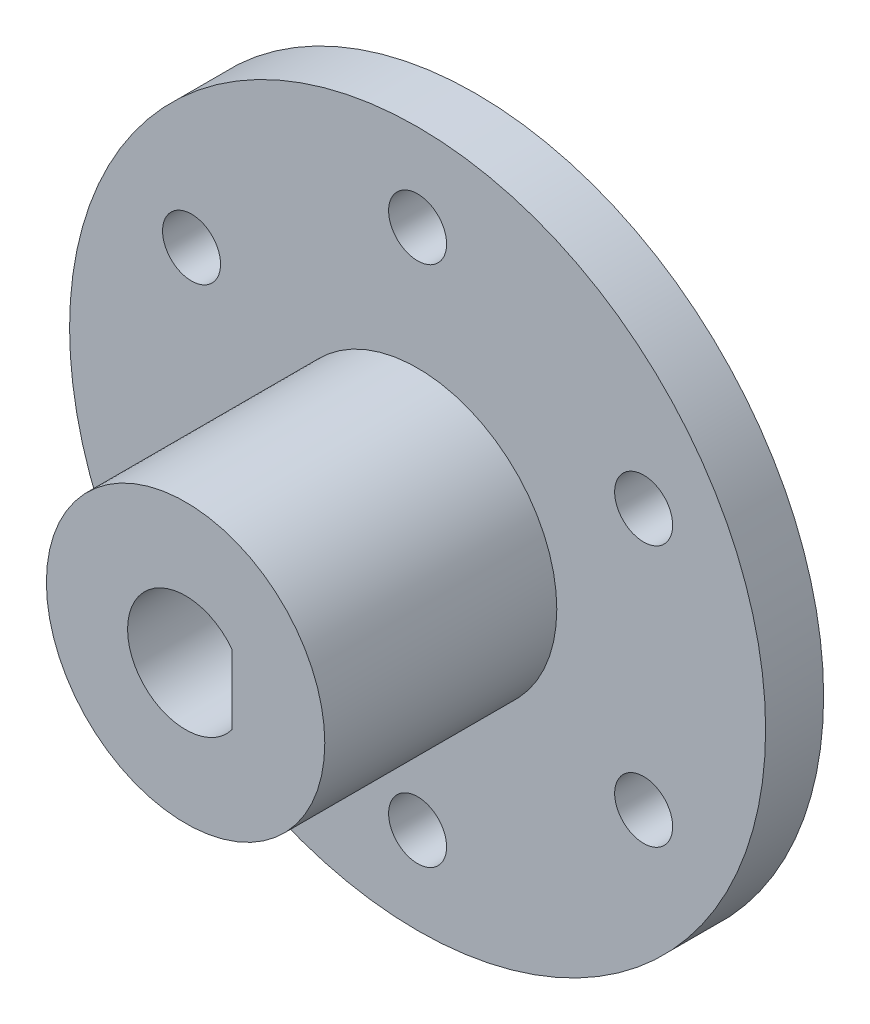
ISO-10303-21;
HEADER;
FILE_DESCRIPTION(('STEP AP214'),'2;1');
FILE_NAME('part.step','',(''),(''),'','','');
FILE_SCHEMA(('AUTOMOTIVE_DESIGN { 1 0 10303 214 1 1 1 1 }'));
ENDSEC;
DATA;
#1=APPLICATION_CONTEXT('core data for automotive mechanical design processes');
#2=APPLICATION_PROTOCOL_DEFINITION('international standard','automotive_design',2000,#1);
#3=PRODUCT_CONTEXT('',#1,'mechanical');
#4=PRODUCT('Part','Part','',(#3));
#5=PRODUCT_RELATED_PRODUCT_CATEGORY('part','',(#4));
#6=PRODUCT_DEFINITION_FORMATION('','',#4);
#7=PRODUCT_DEFINITION_CONTEXT('part definition',#1,'design');
#8=PRODUCT_DEFINITION('design','',#6,#7);
#9=PRODUCT_DEFINITION_SHAPE('','',#8);
#10=(LENGTH_UNIT() NAMED_UNIT(*) SI_UNIT(.MILLI.,.METRE.));
#11=(NAMED_UNIT(*) PLANE_ANGLE_UNIT() SI_UNIT($,.RADIAN.));
#12=(NAMED_UNIT(*) SI_UNIT($,.STERADIAN.) SOLID_ANGLE_UNIT());
#13=UNCERTAINTY_MEASURE_WITH_UNIT(LENGTH_MEASURE(1.E-05),#10,'distance_accuracy_value','');
#14=(GEOMETRIC_REPRESENTATION_CONTEXT(3) GLOBAL_UNCERTAINTY_ASSIGNED_CONTEXT((#13)) GLOBAL_UNIT_ASSIGNED_CONTEXT((#10,
#11,#12)) REPRESENTATION_CONTEXT('',''));
#15=CARTESIAN_POINT('',(0.,0.,0.));
#16=DIRECTION('',(0.,0.,1.));
#17=DIRECTION('',(1.,0.,0.));
#18=AXIS2_PLACEMENT_3D('',#15,#16,#17);
#19=CARTESIAN_POINT('',(0.,0.,25.));
#20=DIRECTION('',(0.,0.,-1.));
#21=DIRECTION('',(-1.,0.,0.));
#22=AXIS2_PLACEMENT_3D('',#19,#20,#21);
#23=CYLINDRICAL_SURFACE('',#22,12.);
#24=CARTESIAN_POINT('',(0.,0.,5.));
#25=DIRECTION('',(0.,0.,-1.));
#26=DIRECTION('',(-1.,0.,0.));
#27=AXIS2_PLACEMENT_3D('',#24,#25,#26);
#28=CIRCLE('',#27,12.);
#29=CARTESIAN_POINT('',(-12.,0.,5.));
#30=VERTEX_POINT('',#29);
#31=EDGE_CURVE('E68',#30,#30,#28,.T.);
#32=ORIENTED_EDGE('',*,*,#31,.F.);
#33=EDGE_LOOP('',(#32));
#34=FACE_BOUND('',#33,.T.);
#35=CARTESIAN_POINT('',(0.,0.,25.));
#36=DIRECTION('',(0.,0.,-1.));
#37=DIRECTION('',(-1.,0.,0.));
#38=AXIS2_PLACEMENT_3D('',#35,#36,#37);
#39=CIRCLE('',#38,12.);
#40=CARTESIAN_POINT('',(-12.,0.,25.));
#41=VERTEX_POINT('',#40);
#42=EDGE_CURVE('E31',#41,#41,#39,.F.);
#43=ORIENTED_EDGE('',*,*,#42,.F.);
#44=EDGE_LOOP('',(#43));
#45=FACE_BOUND('',#44,.T.);
#46=ADVANCED_FACE('F27',(#34,#45),#23,.T.);
#47=CARTESIAN_POINT('',(-12.144,-12.144,25.));
#48=DIRECTION('',(0.,0.,1.));
#49=DIRECTION('',(1.,0.,0.));
#50=AXIS2_PLACEMENT_3D('',#47,#48,#49);
#51=PLANE('',#50);
#52=CARTESIAN_POINT('',(0.,0.,25.));
#53=DIRECTION('',(0.,0.,1.));
#54=DIRECTION('',(0.,-1.,0.));
#55=AXIS2_PLACEMENT_3D('',#52,#53,#54);
#56=CIRCLE('',#55,5.);
#57=CARTESIAN_POINT('',(3.99999999968993,3.00000000041343,25.));
#58=VERTEX_POINT('',#57);
#59=CARTESIAN_POINT('',(3.99999999942055,-3.0000000007726,25.));
#60=VERTEX_POINT('',#59);
#61=EDGE_CURVE('E59',#58,#60,#56,.T.);
#62=ORIENTED_EDGE('',*,*,#61,.F.);
#63=DIRECTION('',(0.,1.,0.));
#64=VECTOR('',#63,1.);
#65=CARTESIAN_POINT('',(4.,0.,25.));
#66=LINE('',#65,#64);
#67=EDGE_CURVE('E54',#60,#58,#66,.T.);
#68=ORIENTED_EDGE('',*,*,#67,.F.);
#69=EDGE_LOOP('',(#62,#68));
#70=FACE_BOUND('',#69,.T.);
#71=ORIENTED_EDGE('',*,*,#42,.T.);
#72=EDGE_LOOP('',(#71));
#73=FACE_BOUND('',#72,.T.);
#74=ADVANCED_FACE('F66',(#70,#73),#51,.T.);
#75=CARTESIAN_POINT('',(-30.36,-30.36,5.));
#76=DIRECTION('',(0.,0.,1.));
#77=DIRECTION('',(1.,0.,0.));
#78=AXIS2_PLACEMENT_3D('',#75,#76,#77);
#79=PLANE('',#78);
#80=ORIENTED_EDGE('',*,*,#31,.T.);
#81=EDGE_LOOP('',(#80));
#82=FACE_BOUND('',#81,.T.);
#83=CARTESIAN_POINT('',(19.485571585,11.25,5.));
#84=DIRECTION('',(0.,0.,1.));
#85=DIRECTION('',(1.,0.,0.));
#86=AXIS2_PLACEMENT_3D('',#83,#84,#85);
#87=CIRCLE('',#86,2.5);
#88=CARTESIAN_POINT('',(21.985571585,11.25,5.));
#89=VERTEX_POINT('',#88);
#90=EDGE_CURVE('E101',#89,#89,#87,.T.);
#91=ORIENTED_EDGE('',*,*,#90,.F.);
#92=EDGE_LOOP('',(#91));
#93=FACE_BOUND('',#92,.T.);
#94=CARTESIAN_POINT('',(-19.485571585,-11.25,5.));
#95=DIRECTION('',(0.,0.,1.));
#96=DIRECTION('',(1.,0.,0.));
#97=AXIS2_PLACEMENT_3D('',#94,#95,#96);
#98=CIRCLE('',#97,2.5);
#99=CARTESIAN_POINT('',(-16.985571585,-11.25,5.));
#100=VERTEX_POINT('',#99);
#101=EDGE_CURVE('E104',#100,#100,#98,.T.);
#102=ORIENTED_EDGE('',*,*,#101,.F.);
#103=EDGE_LOOP('',(#102));
#104=FACE_BOUND('',#103,.T.);
#105=CARTESIAN_POINT('',(0.,22.5,5.));
#106=DIRECTION('',(0.,0.,1.));
#107=DIRECTION('',(1.,0.,0.));
#108=AXIS2_PLACEMENT_3D('',#105,#106,#107);
#109=CIRCLE('',#108,2.5);
#110=CARTESIAN_POINT('',(2.5,22.5,5.));
#111=VERTEX_POINT('',#110);
#112=EDGE_CURVE('E107',#111,#111,#109,.T.);
#113=ORIENTED_EDGE('',*,*,#112,.F.);
#114=EDGE_LOOP('',(#113));
#115=FACE_BOUND('',#114,.T.);
#116=CARTESIAN_POINT('',(19.485571585,-11.25,5.));
#117=DIRECTION('',(0.,0.,1.));
#118=DIRECTION('',(1.,0.,0.));
#119=AXIS2_PLACEMENT_3D('',#116,#117,#118);
#120=CIRCLE('',#119,2.5);
#121=CARTESIAN_POINT('',(21.985571585,-11.25,5.));
#122=VERTEX_POINT('',#121);
#123=EDGE_CURVE('E110',#122,#122,#120,.T.);
#124=ORIENTED_EDGE('',*,*,#123,.F.);
#125=EDGE_LOOP('',(#124));
#126=FACE_BOUND('',#125,.T.);
#127=CARTESIAN_POINT('',(-19.485571585,11.25,5.));
#128=DIRECTION('',(0.,0.,1.));
#129=DIRECTION('',(1.,0.,0.));
#130=AXIS2_PLACEMENT_3D('',#127,#128,#129);
#131=CIRCLE('',#130,2.5);
#132=CARTESIAN_POINT('',(-16.985571585,11.25,5.));
#133=VERTEX_POINT('',#132);
#134=EDGE_CURVE('E113',#133,#133,#131,.T.);
#135=ORIENTED_EDGE('',*,*,#134,.F.);
#136=EDGE_LOOP('',(#135));
#137=FACE_BOUND('',#136,.T.);
#138=CARTESIAN_POINT('',(0.,-22.5,5.));
#139=DIRECTION('',(0.,0.,1.));
#140=DIRECTION('',(1.,0.,0.));
#141=AXIS2_PLACEMENT_3D('',#138,#139,#140);
#142=CIRCLE('',#141,2.5);
#143=CARTESIAN_POINT('',(2.5,-22.5,5.));
#144=VERTEX_POINT('',#143);
#145=EDGE_CURVE('E116',#144,#144,#142,.T.);
#146=ORIENTED_EDGE('',*,*,#145,.F.);
#147=EDGE_LOOP('',(#146));
#148=FACE_BOUND('',#147,.T.);
#149=CARTESIAN_POINT('',(0.,0.,5.));
#150=DIRECTION('',(0.,0.,-1.));
#151=DIRECTION('',(0.,1.,0.));
#152=AXIS2_PLACEMENT_3D('',#149,#150,#151);
#153=CIRCLE('',#152,30.);
#154=CARTESIAN_POINT('',(0.,30.,5.));
#155=VERTEX_POINT('',#154);
#156=EDGE_CURVE('E72',#155,#155,#153,.F.);
#157=ORIENTED_EDGE('',*,*,#156,.T.);
#158=EDGE_LOOP('',(#157));
#159=FACE_BOUND('',#158,.T.);
#160=ADVANCED_FACE('F133',(#82,#93,#104,#115,#126,#137,#148,#159),#79,.T.);
#161=CARTESIAN_POINT('',(4.,-3.,5.));
#162=DIRECTION('',(-1.,0.,0.));
#163=DIRECTION('',(0.,0.,1.));
#164=AXIS2_PLACEMENT_3D('',#161,#162,#163);
#165=PLANE('',#164);
#166=DIRECTION('',(0.,0.,1.));
#167=VECTOR('',#166,1.);
#168=CARTESIAN_POINT('',(3.99999999884109,-3.00000000154521,15.));
#169=LINE('',#168,#167);
#170=CARTESIAN_POINT('',(3.99999999942055,-3.0000000007726,5.));
#171=VERTEX_POINT('',#170);
#172=EDGE_CURVE('E62',#60,#171,#169,.F.);
#173=ORIENTED_EDGE('',*,*,#172,.F.);
#174=ORIENTED_EDGE('',*,*,#67,.T.);
#175=DIRECTION('',(0.,0.,-1.));
#176=VECTOR('',#175,1.);
#177=CARTESIAN_POINT('',(3.99999999937985,3.00000000082686,15.));
#178=LINE('',#177,#176);
#179=CARTESIAN_POINT('',(3.99999999968993,3.00000000041343,5.));
#180=VERTEX_POINT('',#179);
#181=EDGE_CURVE('E63',#180,#58,#178,.F.);
#182=ORIENTED_EDGE('',*,*,#181,.F.);
#183=DIRECTION('',(0.,1.,0.));
#184=VECTOR('',#183,1.);
#185=CARTESIAN_POINT('',(4.,0.,5.));
#186=LINE('',#185,#184);
#187=EDGE_CURVE('E45',#171,#180,#186,.T.);
#188=ORIENTED_EDGE('',*,*,#187,.F.);
#189=EDGE_LOOP('',(#173,#174,#182,#188));
#190=FACE_BOUND('',#189,.T.);
#191=ADVANCED_FACE('F70',(#190),#165,.T.);
#192=CARTESIAN_POINT('',(0.,0.,5.));
#193=DIRECTION('',(0.,0.,1.));
#194=DIRECTION('',(0.,-1.,0.));
#195=AXIS2_PLACEMENT_3D('',#192,#193,#194);
#196=CYLINDRICAL_SURFACE('',#195,5.);
#197=CARTESIAN_POINT('',(0.,0.,5.));
#198=DIRECTION('',(0.,0.,1.));
#199=DIRECTION('',(0.,-1.,0.));
#200=AXIS2_PLACEMENT_3D('',#197,#198,#199);
#201=CIRCLE('',#200,5.);
#202=EDGE_CURVE('E99',#180,#171,#201,.T.);
#203=ORIENTED_EDGE('',*,*,#202,.F.);
#204=ORIENTED_EDGE('',*,*,#181,.T.);
#205=ORIENTED_EDGE('',*,*,#61,.T.);
#206=ORIENTED_EDGE('',*,*,#172,.T.);
#207=EDGE_LOOP('',(#203,#204,#205,#206));
#208=FACE_BOUND('',#207,.T.);
#209=ADVANCED_FACE('F61',(#208),#196,.F.);
#210=CARTESIAN_POINT('',(0.,0.,5.));
#211=DIRECTION('',(0.,0.,-1.));
#212=DIRECTION('',(0.,1.,0.));
#213=AXIS2_PLACEMENT_3D('',#210,#211,#212);
#214=CYLINDRICAL_SURFACE('',#213,30.);
#215=ORIENTED_EDGE('',*,*,#156,.F.);
#216=EDGE_LOOP('',(#215));
#217=FACE_BOUND('',#216,.T.);
#218=CARTESIAN_POINT('',(0.,0.,0.));
#219=DIRECTION('',(0.,0.,-1.));
#220=DIRECTION('',(0.,1.,0.));
#221=AXIS2_PLACEMENT_3D('',#218,#219,#220);
#222=CIRCLE('',#221,30.);
#223=CARTESIAN_POINT('',(0.,30.,0.));
#224=VERTEX_POINT('',#223);
#225=EDGE_CURVE('E96',#224,#224,#222,.F.);
#226=ORIENTED_EDGE('',*,*,#225,.T.);
#227=EDGE_LOOP('',(#226));
#228=FACE_BOUND('',#227,.T.);
#229=ADVANCED_FACE('F170',(#217,#228),#214,.T.);
#230=CARTESIAN_POINT('',(0.,-22.5,0.));
#231=DIRECTION('',(0.,0.,1.));
#232=DIRECTION('',(1.,0.,0.));
#233=AXIS2_PLACEMENT_3D('',#230,#231,#232);
#234=CYLINDRICAL_SURFACE('',#233,2.5);
#235=CARTESIAN_POINT('',(0.,-22.5,0.));
#236=DIRECTION('',(0.,0.,1.));
#237=DIRECTION('',(1.,0.,0.));
#238=AXIS2_PLACEMENT_3D('',#235,#236,#237);
#239=CIRCLE('',#238,2.5);
#240=CARTESIAN_POINT('',(2.5,-22.5,0.));
#241=VERTEX_POINT('',#240);
#242=EDGE_CURVE('E93',#241,#241,#239,.F.);
#243=ORIENTED_EDGE('',*,*,#242,.T.);
#244=EDGE_LOOP('',(#243));
#245=FACE_BOUND('',#244,.T.);
#246=ORIENTED_EDGE('',*,*,#145,.T.);
#247=EDGE_LOOP('',(#246));
#248=FACE_BOUND('',#247,.T.);
#249=ADVANCED_FACE('F166',(#245,#248),#234,.F.);
#250=CARTESIAN_POINT('',(-19.485571585,11.25,0.));
#251=DIRECTION('',(0.,0.,1.));
#252=DIRECTION('',(1.,0.,0.));
#253=AXIS2_PLACEMENT_3D('',#250,#251,#252);
#254=CYLINDRICAL_SURFACE('',#253,2.5);
#255=CARTESIAN_POINT('',(-19.485571585,11.25,0.));
#256=DIRECTION('',(0.,0.,1.));
#257=DIRECTION('',(1.,0.,0.));
#258=AXIS2_PLACEMENT_3D('',#255,#256,#257);
#259=CIRCLE('',#258,2.5);
#260=CARTESIAN_POINT('',(-16.985571585,11.25,0.));
#261=VERTEX_POINT('',#260);
#262=EDGE_CURVE('E90',#261,#261,#259,.F.);
#263=ORIENTED_EDGE('',*,*,#262,.T.);
#264=EDGE_LOOP('',(#263));
#265=FACE_BOUND('',#264,.T.);
#266=ORIENTED_EDGE('',*,*,#134,.T.);
#267=EDGE_LOOP('',(#266));
#268=FACE_BOUND('',#267,.T.);
#269=ADVANCED_FACE('F162',(#265,#268),#254,.F.);
#270=CARTESIAN_POINT('',(19.485571585,-11.25,0.));
#271=DIRECTION('',(0.,0.,1.));
#272=DIRECTION('',(1.,0.,0.));
#273=AXIS2_PLACEMENT_3D('',#270,#271,#272);
#274=CYLINDRICAL_SURFACE('',#273,2.5);
#275=CARTESIAN_POINT('',(19.485571585,-11.25,0.));
#276=DIRECTION('',(0.,0.,1.));
#277=DIRECTION('',(1.,0.,0.));
#278=AXIS2_PLACEMENT_3D('',#275,#276,#277);
#279=CIRCLE('',#278,2.5);
#280=CARTESIAN_POINT('',(21.985571585,-11.25,0.));
#281=VERTEX_POINT('',#280);
#282=EDGE_CURVE('E87',#281,#281,#279,.F.);
#283=ORIENTED_EDGE('',*,*,#282,.T.);
#284=EDGE_LOOP('',(#283));
#285=FACE_BOUND('',#284,.T.);
#286=ORIENTED_EDGE('',*,*,#123,.T.);
#287=EDGE_LOOP('',(#286));
#288=FACE_BOUND('',#287,.T.);
#289=ADVANCED_FACE('F158',(#285,#288),#274,.F.);
#290=CARTESIAN_POINT('',(0.,22.5,0.));
#291=DIRECTION('',(0.,0.,1.));
#292=DIRECTION('',(1.,0.,0.));
#293=AXIS2_PLACEMENT_3D('',#290,#291,#292);
#294=CYLINDRICAL_SURFACE('',#293,2.5);
#295=CARTESIAN_POINT('',(0.,22.5,0.));
#296=DIRECTION('',(0.,0.,1.));
#297=DIRECTION('',(1.,0.,0.));
#298=AXIS2_PLACEMENT_3D('',#295,#296,#297);
#299=CIRCLE('',#298,2.5);
#300=CARTESIAN_POINT('',(2.5,22.5,0.));
#301=VERTEX_POINT('',#300);
#302=EDGE_CURVE('E84',#301,#301,#299,.F.);
#303=ORIENTED_EDGE('',*,*,#302,.T.);
#304=EDGE_LOOP('',(#303));
#305=FACE_BOUND('',#304,.T.);
#306=ORIENTED_EDGE('',*,*,#112,.T.);
#307=EDGE_LOOP('',(#306));
#308=FACE_BOUND('',#307,.T.);
#309=ADVANCED_FACE('F154',(#305,#308),#294,.F.);
#310=CARTESIAN_POINT('',(-19.485571585,-11.25,0.));
#311=DIRECTION('',(0.,0.,1.));
#312=DIRECTION('',(1.,0.,0.));
#313=AXIS2_PLACEMENT_3D('',#310,#311,#312);
#314=CYLINDRICAL_SURFACE('',#313,2.5);
#315=CARTESIAN_POINT('',(-19.485571585,-11.25,0.));
#316=DIRECTION('',(0.,0.,1.));
#317=DIRECTION('',(1.,0.,0.));
#318=AXIS2_PLACEMENT_3D('',#315,#316,#317);
#319=CIRCLE('',#318,2.5);
#320=CARTESIAN_POINT('',(-16.985571585,-11.25,0.));
#321=VERTEX_POINT('',#320);
#322=EDGE_CURVE('E81',#321,#321,#319,.F.);
#323=ORIENTED_EDGE('',*,*,#322,.T.);
#324=EDGE_LOOP('',(#323));
#325=FACE_BOUND('',#324,.T.);
#326=ORIENTED_EDGE('',*,*,#101,.T.);
#327=EDGE_LOOP('',(#326));
#328=FACE_BOUND('',#327,.T.);
#329=ADVANCED_FACE('F150',(#325,#328),#314,.F.);
#330=CARTESIAN_POINT('',(19.485571585,11.25,0.));
#331=DIRECTION('',(0.,0.,1.));
#332=DIRECTION('',(1.,0.,0.));
#333=AXIS2_PLACEMENT_3D('',#330,#331,#332);
#334=CYLINDRICAL_SURFACE('',#333,2.5);
#335=CARTESIAN_POINT('',(19.485571585,11.25,0.));
#336=DIRECTION('',(0.,0.,1.));
#337=DIRECTION('',(1.,0.,0.));
#338=AXIS2_PLACEMENT_3D('',#335,#336,#337);
#339=CIRCLE('',#338,2.5);
#340=CARTESIAN_POINT('',(21.985571585,11.25,0.));
#341=VERTEX_POINT('',#340);
#342=EDGE_CURVE('E78',#341,#341,#339,.F.);
#343=ORIENTED_EDGE('',*,*,#342,.T.);
#344=EDGE_LOOP('',(#343));
#345=FACE_BOUND('',#344,.T.);
#346=ORIENTED_EDGE('',*,*,#90,.T.);
#347=EDGE_LOOP('',(#346));
#348=FACE_BOUND('',#347,.T.);
#349=ADVANCED_FACE('F147',(#345,#348),#334,.F.);
#350=CARTESIAN_POINT('',(-5.054,-5.06,5.));
#351=DIRECTION('',(0.,0.,1.));
#352=DIRECTION('',(1.,0.,0.));
#353=AXIS2_PLACEMENT_3D('',#350,#351,#352);
#354=PLANE('',#353);
#355=CARTESIAN_POINT('',(0.,0.,5.));
#356=DIRECTION('',(0.,0.,-1.));
#357=DIRECTION('',(0.,1.,0.));
#358=AXIS2_PLACEMENT_3D('',#355,#356,#357);
#359=CIRCLE('',#358,2.5);
#360=CARTESIAN_POINT('',(0.,2.5,5.));
#361=VERTEX_POINT('',#360);
#362=EDGE_CURVE('E37',#361,#361,#359,.F.);
#363=ORIENTED_EDGE('',*,*,#362,.F.);
#364=EDGE_LOOP('',(#363));
#365=FACE_BOUND('',#364,.T.);
#366=ORIENTED_EDGE('',*,*,#187,.T.);
#367=ORIENTED_EDGE('',*,*,#202,.T.);
#368=EDGE_LOOP('',(#366,#367));
#369=FACE_BOUND('',#368,.T.);
#370=ADVANCED_FACE('F143',(#365,#369),#354,.T.);
#371=CARTESIAN_POINT('',(-30.36,-30.36,0.));
#372=DIRECTION('',(0.,0.,1.));
#373=DIRECTION('',(1.,0.,0.));
#374=AXIS2_PLACEMENT_3D('',#371,#372,#373);
#375=PLANE('',#374);
#376=ORIENTED_EDGE('',*,*,#342,.F.);
#377=EDGE_LOOP('',(#376));
#378=FACE_BOUND('',#377,.T.);
#379=ORIENTED_EDGE('',*,*,#322,.F.);
#380=EDGE_LOOP('',(#379));
#381=FACE_BOUND('',#380,.T.);
#382=ORIENTED_EDGE('',*,*,#302,.F.);
#383=EDGE_LOOP('',(#382));
#384=FACE_BOUND('',#383,.T.);
#385=ORIENTED_EDGE('',*,*,#282,.F.);
#386=EDGE_LOOP('',(#385));
#387=FACE_BOUND('',#386,.T.);
#388=ORIENTED_EDGE('',*,*,#262,.F.);
#389=EDGE_LOOP('',(#388));
#390=FACE_BOUND('',#389,.T.);
#391=ORIENTED_EDGE('',*,*,#242,.F.);
#392=EDGE_LOOP('',(#391));
#393=FACE_BOUND('',#392,.T.);
#394=CARTESIAN_POINT('',(0.,0.,0.));
#395=DIRECTION('',(0.,0.,-1.));
#396=DIRECTION('',(0.,1.,0.));
#397=AXIS2_PLACEMENT_3D('',#394,#395,#396);
#398=CIRCLE('',#397,2.5);
#399=CARTESIAN_POINT('',(0.,2.5,0.));
#400=VERTEX_POINT('',#399);
#401=EDGE_CURVE('E13',#400,#400,#398,.T.);
#402=ORIENTED_EDGE('',*,*,#401,.F.);
#403=EDGE_LOOP('',(#402));
#404=FACE_BOUND('',#403,.T.);
#405=ORIENTED_EDGE('',*,*,#225,.F.);
#406=EDGE_LOOP('',(#405));
#407=FACE_BOUND('',#406,.T.);
#408=ADVANCED_FACE('F29',(#378,#381,#384,#387,#390,#393,#404,#407),#375,.F.);
#409=CARTESIAN_POINT('',(0.,0.,5.));
#410=DIRECTION('',(0.,0.,-1.));
#411=DIRECTION('',(0.,1.,0.));
#412=AXIS2_PLACEMENT_3D('',#409,#410,#411);
#413=CYLINDRICAL_SURFACE('',#412,2.5);
#414=ORIENTED_EDGE('',*,*,#401,.T.);
#415=EDGE_LOOP('',(#414));
#416=FACE_BOUND('',#415,.T.);
#417=ORIENTED_EDGE('',*,*,#362,.T.);
#418=EDGE_LOOP('',(#417));
#419=FACE_BOUND('',#418,.T.);
#420=ADVANCED_FACE('F136',(#416,#419),#413,.F.);
#421=CLOSED_SHELL('',(#46,#74,#160,#191,#209,#229,#249,#269,#289,#309,#329,#349,#370,#408,#420));
#422=MANIFOLD_SOLID_BREP('B1',#421);
#423=ADVANCED_BREP_SHAPE_REPRESENTATION('',(#18,#422),#14);
#424=SHAPE_DEFINITION_REPRESENTATION(#9,#423);
ENDSEC;
END-ISO-10303-21;
